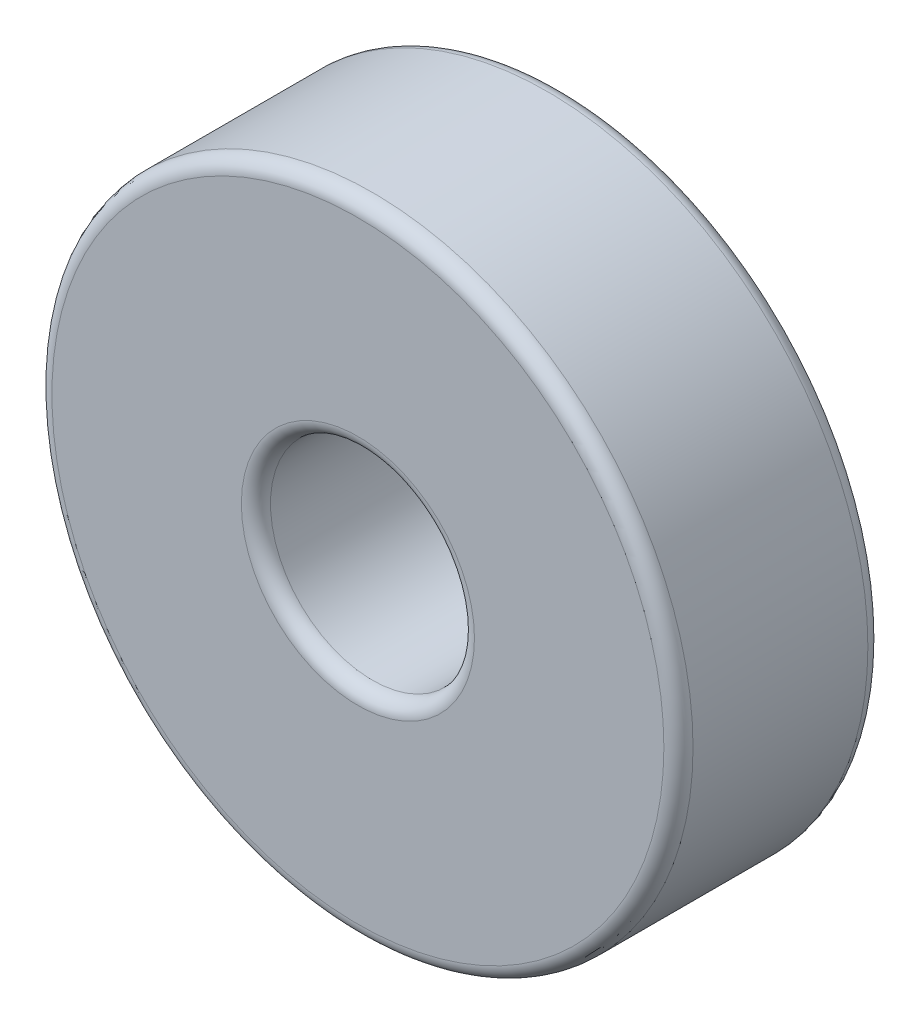
ISO-10303-21;
HEADER;
FILE_DESCRIPTION(('STEP AP214'),'2;1');
FILE_NAME('part.step','',(''),(''),'','','');
FILE_SCHEMA(('AUTOMOTIVE_DESIGN { 1 0 10303 214 1 1 1 1 }'));
ENDSEC;
DATA;
#1=APPLICATION_CONTEXT('core data for automotive mechanical design processes');
#2=APPLICATION_PROTOCOL_DEFINITION('international standard','automotive_design',2000,#1);
#3=PRODUCT_CONTEXT('',#1,'mechanical');
#4=PRODUCT('Part','Part','',(#3));
#5=PRODUCT_RELATED_PRODUCT_CATEGORY('part','',(#4));
#6=PRODUCT_DEFINITION_FORMATION('','',#4);
#7=PRODUCT_DEFINITION_CONTEXT('part definition',#1,'design');
#8=PRODUCT_DEFINITION('design','',#6,#7);
#9=PRODUCT_DEFINITION_SHAPE('','',#8);
#10=(LENGTH_UNIT() NAMED_UNIT(*) SI_UNIT(.MILLI.,.METRE.));
#11=(NAMED_UNIT(*) PLANE_ANGLE_UNIT() SI_UNIT($,.RADIAN.));
#12=(NAMED_UNIT(*) SI_UNIT($,.STERADIAN.) SOLID_ANGLE_UNIT());
#13=UNCERTAINTY_MEASURE_WITH_UNIT(LENGTH_MEASURE(1.E-05),#10,'distance_accuracy_value','');
#14=(GEOMETRIC_REPRESENTATION_CONTEXT(3) GLOBAL_UNCERTAINTY_ASSIGNED_CONTEXT((#13)) GLOBAL_UNIT_ASSIGNED_CONTEXT((#10,
#11,#12)) REPRESENTATION_CONTEXT('',''));
#15=CARTESIAN_POINT('',(0.,0.,0.));
#16=DIRECTION('',(0.,0.,1.));
#17=DIRECTION('',(1.,0.,0.));
#18=AXIS2_PLACEMENT_3D('',#15,#16,#17);
#19=CARTESIAN_POINT('',(0.,0.,7.));
#20=DIRECTION('',(0.,0.,1.));
#21=DIRECTION('',(1.,0.,0.));
#22=AXIS2_PLACEMENT_3D('',#19,#20,#21);
#23=PLANE('',#22);
#24=CARTESIAN_POINT('',(0.,0.,7.));
#25=DIRECTION('',(0.,0.,1.));
#26=DIRECTION('',(1.,0.,0.));
#27=AXIS2_PLACEMENT_3D('',#24,#25,#26);
#28=CIRCLE('',#27,4.);
#29=CARTESIAN_POINT('',(4.,0.,7.));
#30=VERTEX_POINT('',#29);
#31=EDGE_CURVE('E48',#30,#30,#28,.F.);
#32=ORIENTED_EDGE('',*,*,#31,.T.);
#33=EDGE_LOOP('',(#32));
#34=FACE_BOUND('',#33,.T.);
#35=CARTESIAN_POINT('',(0.,0.,7.));
#36=DIRECTION('',(0.,0.,1.));
#37=DIRECTION('',(1.,0.,0.));
#38=AXIS2_PLACEMENT_3D('',#35,#36,#37);
#39=CIRCLE('',#38,10.5);
#40=CARTESIAN_POINT('',(10.5,0.,7.));
#41=VERTEX_POINT('',#40);
#42=EDGE_CURVE('E52',#41,#41,#39,.T.);
#43=ORIENTED_EDGE('',*,*,#42,.T.);
#44=EDGE_LOOP('',(#43));
#45=FACE_BOUND('',#44,.T.);
#46=ADVANCED_FACE('F37',(#34,#45),#23,.T.);
#47=CARTESIAN_POINT('',(0.,0.,0.));
#48=DIRECTION('',(0.,0.,1.));
#49=DIRECTION('',(1.,0.,0.));
#50=AXIS2_PLACEMENT_3D('',#47,#48,#49);
#51=PLANE('',#50);
#52=CARTESIAN_POINT('',(0.,0.,0.));
#53=DIRECTION('',(0.,0.,1.));
#54=DIRECTION('',(1.,0.,0.));
#55=AXIS2_PLACEMENT_3D('',#52,#53,#54);
#56=CIRCLE('',#55,4.);
#57=CARTESIAN_POINT('',(4.,0.,0.));
#58=VERTEX_POINT('',#57);
#59=EDGE_CURVE('E63',#58,#58,#56,.T.);
#60=ORIENTED_EDGE('',*,*,#59,.T.);
#61=EDGE_LOOP('',(#60));
#62=FACE_BOUND('',#61,.T.);
#63=CARTESIAN_POINT('',(0.,0.,0.));
#64=DIRECTION('',(0.,0.,1.));
#65=DIRECTION('',(1.,0.,0.));
#66=AXIS2_PLACEMENT_3D('',#63,#64,#65);
#67=CIRCLE('',#66,10.5);
#68=CARTESIAN_POINT('',(10.5,0.,0.));
#69=VERTEX_POINT('',#68);
#70=EDGE_CURVE('E66',#69,#69,#67,.F.);
#71=ORIENTED_EDGE('',*,*,#70,.T.);
#72=EDGE_LOOP('',(#71));
#73=FACE_BOUND('',#72,.T.);
#74=ADVANCED_FACE('F70',(#62,#73),#51,.F.);
#75=CARTESIAN_POINT('',(0.,0.,7.));
#76=DIRECTION('',(0.,0.,-1.));
#77=DIRECTION('',(-1.,0.,0.));
#78=AXIS2_PLACEMENT_3D('',#75,#76,#77);
#79=CYLINDRICAL_SURFACE('',#78,11.);
#80=CARTESIAN_POINT('',(0.,0.,0.5));
#81=DIRECTION('',(0.,0.,1.));
#82=DIRECTION('',(1.,0.,0.));
#83=AXIS2_PLACEMENT_3D('',#80,#81,#82);
#84=CIRCLE('',#83,11.);
#85=CARTESIAN_POINT('',(11.,0.,0.5));
#86=VERTEX_POINT('',#85);
#87=EDGE_CURVE('E11',#86,#86,#84,.T.);
#88=ORIENTED_EDGE('',*,*,#87,.T.);
#89=EDGE_LOOP('',(#88));
#90=FACE_BOUND('',#89,.T.);
#91=CARTESIAN_POINT('',(0.,0.,6.5));
#92=DIRECTION('',(0.,0.,1.));
#93=DIRECTION('',(1.,0.,0.));
#94=AXIS2_PLACEMENT_3D('',#91,#92,#93);
#95=CIRCLE('',#94,11.);
#96=CARTESIAN_POINT('',(11.,0.,6.5));
#97=VERTEX_POINT('',#96);
#98=EDGE_CURVE('E44',#97,#97,#95,.F.);
#99=ORIENTED_EDGE('',*,*,#98,.T.);
#100=EDGE_LOOP('',(#99));
#101=FACE_BOUND('',#100,.T.);
#102=ADVANCED_FACE('F90',(#90,#101),#79,.T.);
#103=CARTESIAN_POINT('',(0.,0.,7.));
#104=DIRECTION('',(0.,0.,-1.));
#105=DIRECTION('',(-1.,0.,0.));
#106=AXIS2_PLACEMENT_3D('',#103,#104,#105);
#107=CYLINDRICAL_SURFACE('',#106,3.5);
#108=CARTESIAN_POINT('',(0.,0.,0.5));
#109=DIRECTION('',(0.,0.,1.));
#110=DIRECTION('',(1.,0.,0.));
#111=AXIS2_PLACEMENT_3D('',#108,#109,#110);
#112=CIRCLE('',#111,3.5);
#113=CARTESIAN_POINT('',(3.5,0.,0.5));
#114=VERTEX_POINT('',#113);
#115=EDGE_CURVE('E57',#114,#114,#112,.F.);
#116=ORIENTED_EDGE('',*,*,#115,.T.);
#117=EDGE_LOOP('',(#116));
#118=FACE_BOUND('',#117,.T.);
#119=CARTESIAN_POINT('',(0.,0.,6.5));
#120=DIRECTION('',(0.,0.,1.));
#121=DIRECTION('',(1.,0.,0.));
#122=AXIS2_PLACEMENT_3D('',#119,#120,#121);
#123=CIRCLE('',#122,3.5);
#124=CARTESIAN_POINT('',(3.5,0.,6.5));
#125=VERTEX_POINT('',#124);
#126=EDGE_CURVE('E60',#125,#125,#123,.T.);
#127=ORIENTED_EDGE('',*,*,#126,.T.);
#128=EDGE_LOOP('',(#127));
#129=FACE_BOUND('',#128,.T.);
#130=ADVANCED_FACE('F95',(#118,#129),#107,.F.);
#131=CARTESIAN_POINT('',(0.,0.,0.5));
#132=DIRECTION('',(0.,0.,1.));
#133=DIRECTION('',(1.,0.,0.));
#134=AXIS2_PLACEMENT_3D('',#131,#132,#133);
#135=TOROIDAL_SURFACE('',#134,4.,0.5);
#136=ORIENTED_EDGE('',*,*,#115,.F.);
#137=EDGE_LOOP('',(#136));
#138=FACE_BOUND('',#137,.T.);
#139=ORIENTED_EDGE('',*,*,#59,.F.);
#140=EDGE_LOOP('',(#139));
#141=FACE_BOUND('',#140,.T.);
#142=ADVANCED_FACE('F81',(#138,#141),#135,.T.);
#143=CARTESIAN_POINT('',(0.,0.,6.5));
#144=DIRECTION('',(0.,0.,1.));
#145=DIRECTION('',(1.,0.,0.));
#146=AXIS2_PLACEMENT_3D('',#143,#144,#145);
#147=TOROIDAL_SURFACE('',#146,4.,0.5);
#148=ORIENTED_EDGE('',*,*,#31,.F.);
#149=EDGE_LOOP('',(#148));
#150=FACE_BOUND('',#149,.T.);
#151=ORIENTED_EDGE('',*,*,#126,.F.);
#152=EDGE_LOOP('',(#151));
#153=FACE_BOUND('',#152,.T.);
#154=ADVANCED_FACE('F75',(#150,#153),#147,.T.);
#155=CARTESIAN_POINT('',(0.,0.,0.5));
#156=DIRECTION('',(0.,0.,1.));
#157=DIRECTION('',(1.,0.,0.));
#158=AXIS2_PLACEMENT_3D('',#155,#156,#157);
#159=TOROIDAL_SURFACE('',#158,10.5,0.5);
#160=ORIENTED_EDGE('',*,*,#70,.F.);
#161=EDGE_LOOP('',(#160));
#162=FACE_BOUND('',#161,.T.);
#163=ORIENTED_EDGE('',*,*,#87,.F.);
#164=EDGE_LOOP('',(#163));
#165=FACE_BOUND('',#164,.T.);
#166=ADVANCED_FACE('F72',(#162,#165),#159,.T.);
#167=CARTESIAN_POINT('',(0.,0.,6.5));
#168=DIRECTION('',(0.,0.,1.));
#169=DIRECTION('',(1.,0.,0.));
#170=AXIS2_PLACEMENT_3D('',#167,#168,#169);
#171=TOROIDAL_SURFACE('',#170,10.5,0.5);
#172=ORIENTED_EDGE('',*,*,#98,.F.);
#173=EDGE_LOOP('',(#172));
#174=FACE_BOUND('',#173,.T.);
#175=ORIENTED_EDGE('',*,*,#42,.F.);
#176=EDGE_LOOP('',(#175));
#177=FACE_BOUND('',#176,.T.);
#178=ADVANCED_FACE('F39',(#174,#177),#171,.T.);
#179=CLOSED_SHELL('',(#46,#74,#102,#130,#142,#154,#166,#178));
#180=MANIFOLD_SOLID_BREP('B2',#179);
#181=ADVANCED_BREP_SHAPE_REPRESENTATION('',(#18,#180),#14);
#182=SHAPE_DEFINITION_REPRESENTATION(#9,#181);
ENDSEC;
END-ISO-10303-21;
